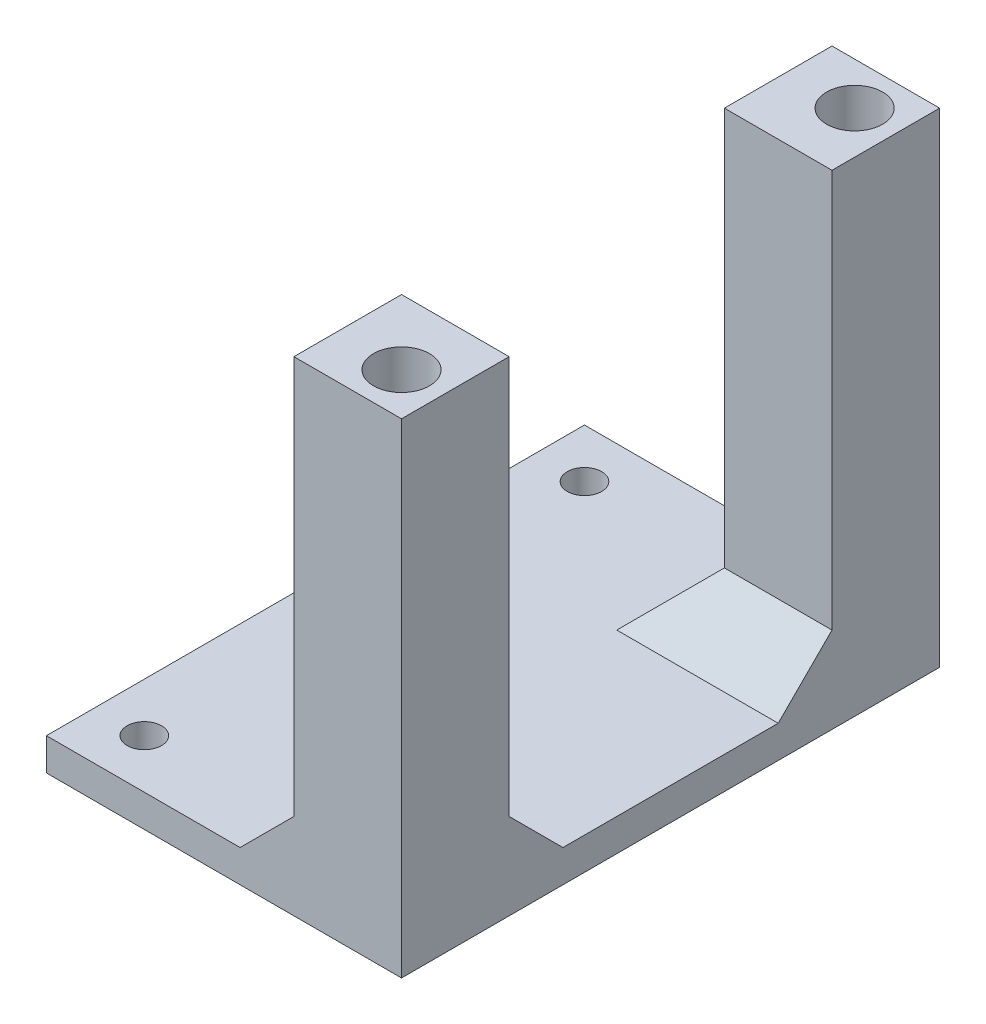
ISO-10303-21;
HEADER;
FILE_DESCRIPTION(('STEP AP214'),'2;1');
FILE_NAME('part.step','',(''),(''),'','','');
FILE_SCHEMA(('AUTOMOTIVE_DESIGN { 1 0 10303 214 1 1 1 1 }'));
ENDSEC;
DATA;
#1=APPLICATION_CONTEXT('core data for automotive mechanical design processes');
#2=APPLICATION_PROTOCOL_DEFINITION('international standard','automotive_design',2000,#1);
#3=PRODUCT_CONTEXT('',#1,'mechanical');
#4=PRODUCT('Part','Part','',(#3));
#5=PRODUCT_RELATED_PRODUCT_CATEGORY('part','',(#4));
#6=PRODUCT_DEFINITION_FORMATION('','',#4);
#7=PRODUCT_DEFINITION_CONTEXT('part definition',#1,'design');
#8=PRODUCT_DEFINITION('design','',#6,#7);
#9=PRODUCT_DEFINITION_SHAPE('','',#8);
#10=(LENGTH_UNIT() NAMED_UNIT(*) SI_UNIT(.MILLI.,.METRE.));
#11=(NAMED_UNIT(*) PLANE_ANGLE_UNIT() SI_UNIT($,.RADIAN.));
#12=(NAMED_UNIT(*) SI_UNIT($,.STERADIAN.) SOLID_ANGLE_UNIT());
#13=UNCERTAINTY_MEASURE_WITH_UNIT(LENGTH_MEASURE(1.E-05),#10,'distance_accuracy_value','');
#14=(GEOMETRIC_REPRESENTATION_CONTEXT(3) GLOBAL_UNCERTAINTY_ASSIGNED_CONTEXT((#13)) GLOBAL_UNIT_ASSIGNED_CONTEXT((#10,
#11,#12)) REPRESENTATION_CONTEXT('',''));
#15=CARTESIAN_POINT('',(0.,0.,0.));
#16=DIRECTION('',(0.,0.,1.));
#17=DIRECTION('',(1.,0.,0.));
#18=AXIS2_PLACEMENT_3D('',#15,#16,#17);
#19=CARTESIAN_POINT('',(0.,3.,0.));
#20=DIRECTION('',(0.,-1.,0.));
#21=DIRECTION('',(0.,0.,-1.));
#22=AXIS2_PLACEMENT_3D('',#19,#20,#21);
#23=PLANE('',#22);
#24=CARTESIAN_POINT('',(-1.96239669421488,3.,-5.13595041322314));
#25=DIRECTION('',(0.,1.,0.));
#26=DIRECTION('',(0.,0.,1.));
#27=AXIS2_PLACEMENT_3D('',#24,#25,#26);
#28=CIRCLE('',#27,1.6);
#29=CARTESIAN_POINT('',(-1.96239669421488,3.,-3.53595041322314));
#30=VERTEX_POINT('',#29);
#31=EDGE_CURVE('E277',#30,#30,#28,.T.);
#32=ORIENTED_EDGE('',*,*,#31,.F.);
#33=EDGE_LOOP('',(#32));
#34=FACE_BOUND('',#33,.T.);
#35=CARTESIAN_POINT('',(-1.96239669421487,3.,35.7640495867769));
#36=DIRECTION('',(0.,1.,0.));
#37=DIRECTION('',(0.,0.,1.));
#38=AXIS2_PLACEMENT_3D('',#35,#36,#37);
#39=CIRCLE('',#38,1.6);
#40=CARTESIAN_POINT('',(-1.96239669421487,3.,37.3640495867769));
#41=VERTEX_POINT('',#40);
#42=EDGE_CURVE('E269',#41,#41,#39,.T.);
#43=ORIENTED_EDGE('',*,*,#42,.F.);
#44=EDGE_LOOP('',(#43));
#45=FACE_BOUND('',#44,.T.);
#46=DIRECTION('',(-1.,0.,0.));
#47=VECTOR('',#46,1.);
#48=CARTESIAN_POINT('',(16.4876033057851,3.,5.31404958677684));
#49=LINE('',#48,#47);
#50=CARTESIAN_POINT('',(26.4876033057851,3.,5.31404958677684));
#51=VERTEX_POINT('',#50);
#52=CARTESIAN_POINT('',(11.4876033057851,3.,5.31404958677685));
#53=VERTEX_POINT('',#52);
#54=EDGE_CURVE('E329',#51,#53,#49,.T.);
#55=ORIENTED_EDGE('',*,*,#54,.T.);
#56=DIRECTION('',(0.,0.,-1.));
#57=VECTOR('',#56,1.);
#58=CARTESIAN_POINT('',(11.4876033057851,3.,-9.68595041322314));
#59=LINE('',#58,#57);
#60=CARTESIAN_POINT('',(11.4876033057851,3.,-9.68595041322314));
#61=VERTEX_POINT('',#60);
#62=EDGE_CURVE('E332',#53,#61,#59,.T.);
#63=ORIENTED_EDGE('',*,*,#62,.T.);
#64=DIRECTION('',(1.,0.,0.));
#65=VECTOR('',#64,1.);
#66=CARTESIAN_POINT('',(-6.51239669421488,3.,-9.68595041322314));
#67=LINE('',#66,#65);
#68=CARTESIAN_POINT('',(-6.51239669421488,3.,-9.68595041322314));
#69=VERTEX_POINT('',#68);
#70=EDGE_CURVE('E285',#69,#61,#67,.T.);
#71=ORIENTED_EDGE('',*,*,#70,.F.);
#72=DIRECTION('',(0.,0.,1.));
#73=VECTOR('',#72,1.);
#74=CARTESIAN_POINT('',(-6.51239669421488,3.,-9.68595041322314));
#75=LINE('',#74,#73);
#76=CARTESIAN_POINT('',(-6.51239669421487,3.,40.3140495867769));
#77=VERTEX_POINT('',#76);
#78=EDGE_CURVE('E207',#69,#77,#75,.T.);
#79=ORIENTED_EDGE('',*,*,#78,.T.);
#80=DIRECTION('',(1.,0.,0.));
#81=VECTOR('',#80,1.);
#82=CARTESIAN_POINT('',(1.48760330578513,3.,40.3140495867769));
#83=LINE('',#82,#81);
#84=CARTESIAN_POINT('',(11.4876033057852,3.,40.3140495867769));
#85=VERTEX_POINT('',#84);
#86=EDGE_CURVE('E293',#77,#85,#83,.T.);
#87=ORIENTED_EDGE('',*,*,#86,.T.);
#88=DIRECTION('',(0.,0.,-1.));
#89=VECTOR('',#88,1.);
#90=CARTESIAN_POINT('',(11.4876033057852,3.,30.3140495867769));
#91=LINE('',#90,#89);
#92=CARTESIAN_POINT('',(11.4876033057852,3.,25.3140495867769));
#93=VERTEX_POINT('',#92);
#94=EDGE_CURVE('E326',#85,#93,#91,.T.);
#95=ORIENTED_EDGE('',*,*,#94,.T.);
#96=DIRECTION('',(1.,0.,0.));
#97=VECTOR('',#96,1.);
#98=CARTESIAN_POINT('',(26.4876033057851,3.,25.3140495867769));
#99=LINE('',#98,#97);
#100=CARTESIAN_POINT('',(26.4876033057851,3.,25.3140495867769));
#101=VERTEX_POINT('',#100);
#102=EDGE_CURVE('E323',#93,#101,#99,.T.);
#103=ORIENTED_EDGE('',*,*,#102,.T.);
#104=DIRECTION('',(0.,0.,1.));
#105=VECTOR('',#104,1.);
#106=CARTESIAN_POINT('',(26.4876033057851,3.,-9.68595041322314));
#107=LINE('',#106,#105);
#108=EDGE_CURVE('E289',#51,#101,#107,.T.);
#109=ORIENTED_EDGE('',*,*,#108,.F.);
#110=EDGE_LOOP('',(#55,#63,#71,#79,#87,#95,#103,#109));
#111=FACE_BOUND('',#110,.T.);
#112=ADVANCED_FACE('F95',(#34,#45,#111),#23,.F.);
#113=CARTESIAN_POINT('',(0.,0.,0.));
#114=DIRECTION('',(0.,-1.,0.));
#115=DIRECTION('',(0.,0.,-1.));
#116=AXIS2_PLACEMENT_3D('',#113,#114,#115);
#117=PLANE('',#116);
#118=CARTESIAN_POINT('',(22.5376033057851,0.,36.3640495867769));
#119=DIRECTION('',(0.,-1.,0.));
#120=DIRECTION('',(0.,0.,-1.));
#121=AXIS2_PLACEMENT_3D('',#118,#119,#120);
#122=CIRCLE('',#121,2.6);
#123=CARTESIAN_POINT('',(22.5376033057851,0.,33.7640495867769));
#124=VERTEX_POINT('',#123);
#125=EDGE_CURVE('E228',#124,#124,#122,.T.);
#126=ORIENTED_EDGE('',*,*,#125,.F.);
#127=EDGE_LOOP('',(#126));
#128=FACE_BOUND('',#127,.T.);
#129=CARTESIAN_POINT('',(22.5376033057851,0.,-5.73595041322314));
#130=DIRECTION('',(0.,-1.,0.));
#131=DIRECTION('',(0.,0.,-1.));
#132=AXIS2_PLACEMENT_3D('',#129,#130,#131);
#133=CIRCLE('',#132,2.6);
#134=CARTESIAN_POINT('',(22.5376033057851,0.,-8.33595041322314));
#135=VERTEX_POINT('',#134);
#136=EDGE_CURVE('E370',#135,#135,#133,.T.);
#137=ORIENTED_EDGE('',*,*,#136,.F.);
#138=EDGE_LOOP('',(#137));
#139=FACE_BOUND('',#138,.T.);
#140=CARTESIAN_POINT('',(-1.96239669421488,0.,-5.13595041322314));
#141=DIRECTION('',(0.,1.,0.));
#142=DIRECTION('',(0.,0.,1.));
#143=AXIS2_PLACEMENT_3D('',#140,#141,#142);
#144=CIRCLE('',#143,1.6);
#145=CARTESIAN_POINT('',(-1.96239669421488,0.,-3.53595041322314));
#146=VERTEX_POINT('',#145);
#147=EDGE_CURVE('E273',#146,#146,#144,.T.);
#148=ORIENTED_EDGE('',*,*,#147,.T.);
#149=EDGE_LOOP('',(#148));
#150=FACE_BOUND('',#149,.T.);
#151=DIRECTION('',(0.,0.,1.));
#152=VECTOR('',#151,1.);
#153=CARTESIAN_POINT('',(-6.51239669421488,0.,-9.68595041322314));
#154=LINE('',#153,#152);
#155=CARTESIAN_POINT('',(-6.51239669421488,0.,-9.68595041322314));
#156=VERTEX_POINT('',#155);
#157=CARTESIAN_POINT('',(-6.51239669421487,0.,40.3140495867769));
#158=VERTEX_POINT('',#157);
#159=EDGE_CURVE('E290',#156,#158,#154,.T.);
#160=ORIENTED_EDGE('',*,*,#159,.F.);
#161=DIRECTION('',(1.,0.,0.));
#162=VECTOR('',#161,1.);
#163=CARTESIAN_POINT('',(1.48760330578512,0.,-9.68595041322314));
#164=LINE('',#163,#162);
#165=CARTESIAN_POINT('',(26.4876033057851,0.,-9.68595041322314));
#166=VERTEX_POINT('',#165);
#167=EDGE_CURVE('E281',#156,#166,#164,.T.);
#168=ORIENTED_EDGE('',*,*,#167,.T.);
#169=DIRECTION('',(0.,0.,1.));
#170=VECTOR('',#169,1.);
#171=CARTESIAN_POINT('',(26.4876033057851,0.,-9.68595041322314));
#172=LINE('',#171,#170);
#173=CARTESIAN_POINT('',(26.4876033057851,0.,40.3140495867769));
#174=VERTEX_POINT('',#173);
#175=EDGE_CURVE('E202',#166,#174,#172,.T.);
#176=ORIENTED_EDGE('',*,*,#175,.T.);
#177=DIRECTION('',(1.,0.,0.));
#178=VECTOR('',#177,1.);
#179=CARTESIAN_POINT('',(-6.51239669421487,0.,40.3140495867769));
#180=LINE('',#179,#178);
#181=EDGE_CURVE('E304',#158,#174,#180,.T.);
#182=ORIENTED_EDGE('',*,*,#181,.F.);
#183=EDGE_LOOP('',(#160,#168,#176,#182));
#184=FACE_BOUND('',#183,.T.);
#185=CARTESIAN_POINT('',(-1.96239669421487,0.,35.7640495867769));
#186=DIRECTION('',(0.,1.,0.));
#187=DIRECTION('',(0.,0.,1.));
#188=AXIS2_PLACEMENT_3D('',#185,#186,#187);
#189=CIRCLE('',#188,1.6);
#190=CARTESIAN_POINT('',(-1.96239669421487,0.,37.3640495867769));
#191=VERTEX_POINT('',#190);
#192=EDGE_CURVE('E268',#191,#191,#189,.T.);
#193=ORIENTED_EDGE('',*,*,#192,.T.);
#194=EDGE_LOOP('',(#193));
#195=FACE_BOUND('',#194,.T.);
#196=ADVANCED_FACE('F405',(#128,#139,#150,#184,#195),#117,.T.);
#197=CARTESIAN_POINT('',(-6.51239669421488,3.,-9.68595041322314));
#198=DIRECTION('',(1.,0.,0.));
#199=DIRECTION('',(0.,0.,-1.));
#200=AXIS2_PLACEMENT_3D('',#197,#198,#199);
#201=PLANE('',#200);
#202=ORIENTED_EDGE('',*,*,#159,.T.);
#203=DIRECTION('',(0.,-1.,0.));
#204=VECTOR('',#203,1.);
#205=CARTESIAN_POINT('',(-6.51239669421487,3.,40.3140495867769));
#206=LINE('',#205,#204);
#207=EDGE_CURVE('E314',#77,#158,#206,.T.);
#208=ORIENTED_EDGE('',*,*,#207,.F.);
#209=ORIENTED_EDGE('',*,*,#78,.F.);
#210=DIRECTION('',(0.,-1.,0.));
#211=VECTOR('',#210,1.);
#212=CARTESIAN_POINT('',(-6.51239669421488,3.,-9.68595041322314));
#213=LINE('',#212,#211);
#214=EDGE_CURVE('E309',#69,#156,#213,.T.);
#215=ORIENTED_EDGE('',*,*,#214,.T.);
#216=EDGE_LOOP('',(#202,#208,#209,#215));
#217=FACE_BOUND('',#216,.T.);
#218=ADVANCED_FACE('F411',(#217),#201,.F.);
#219=CARTESIAN_POINT('',(-6.51239669421487,3.,40.3140495867769));
#220=DIRECTION('',(0.,0.,-1.));
#221=DIRECTION('',(-1.,0.,0.));
#222=AXIS2_PLACEMENT_3D('',#219,#220,#221);
#223=PLANE('',#222);
#224=ORIENTED_EDGE('',*,*,#181,.T.);
#225=DIRECTION('',(0.,-1.,0.));
#226=VECTOR('',#225,1.);
#227=CARTESIAN_POINT('',(26.4876033057851,3.,40.3140495867769));
#228=LINE('',#227,#226);
#229=CARTESIAN_POINT('',(26.4876033057851,45.,40.3140495867769));
#230=VERTEX_POINT('',#229);
#231=EDGE_CURVE('E206',#230,#174,#228,.T.);
#232=ORIENTED_EDGE('',*,*,#231,.F.);
#233=DIRECTION('',(1.,0.,0.));
#234=VECTOR('',#233,1.);
#235=CARTESIAN_POINT('',(26.4876033057851,45.,40.3140495867769));
#236=LINE('',#235,#234);
#237=CARTESIAN_POINT('',(16.4876033057851,45.,40.3140495867769));
#238=VERTEX_POINT('',#237);
#239=EDGE_CURVE('E254',#238,#230,#236,.T.);
#240=ORIENTED_EDGE('',*,*,#239,.F.);
#241=DIRECTION('',(0.,-1.,0.));
#242=VECTOR('',#241,1.);
#243=CARTESIAN_POINT('',(16.4876033057851,45.,40.3140495867769));
#244=LINE('',#243,#242);
#245=CARTESIAN_POINT('',(16.4876033057851,8.00000000000004,40.3140495867769));
#246=VERTEX_POINT('',#245);
#247=EDGE_CURVE('E258',#238,#246,#244,.T.);
#248=ORIENTED_EDGE('',*,*,#247,.T.);
#249=DIRECTION('',(0.707106781186544,0.707106781186551,0.));
#250=VECTOR('',#249,1.);
#251=CARTESIAN_POINT('',(2.48760330578524,-6.00000000000001,40.3140495867769));
#252=LINE('',#251,#250);
#253=EDGE_CURVE('E106',#246,#85,#252,.F.);
#254=ORIENTED_EDGE('',*,*,#253,.T.);
#255=ORIENTED_EDGE('',*,*,#86,.F.);
#256=ORIENTED_EDGE('',*,*,#207,.T.);
#257=EDGE_LOOP('',(#224,#232,#240,#248,#254,#255,#256));
#258=FACE_BOUND('',#257,.T.);
#259=ADVANCED_FACE('F352',(#258),#223,.F.);
#260=CARTESIAN_POINT('',(26.4876033057851,3.,-9.68595041322314));
#261=DIRECTION('',(1.,0.,0.));
#262=DIRECTION('',(0.,0.,-1.));
#263=AXIS2_PLACEMENT_3D('',#260,#261,#262);
#264=PLANE('',#263);
#265=ORIENTED_EDGE('',*,*,#175,.F.);
#266=DIRECTION('',(0.,-1.,0.));
#267=VECTOR('',#266,1.);
#268=CARTESIAN_POINT('',(26.4876033057851,3.,-9.68595041322314));
#269=LINE('',#268,#267);
#270=CARTESIAN_POINT('',(26.4876033057851,45.,-9.68595041322314));
#271=VERTEX_POINT('',#270);
#272=EDGE_CURVE('E194',#271,#166,#269,.T.);
#273=ORIENTED_EDGE('',*,*,#272,.F.);
#274=DIRECTION('',(0.,0.,-1.));
#275=VECTOR('',#274,1.);
#276=CARTESIAN_POINT('',(26.4876033057851,45.,-9.68595041322314));
#277=LINE('',#276,#275);
#278=CARTESIAN_POINT('',(26.4876033057851,45.,0.314049586776862));
#279=VERTEX_POINT('',#278);
#280=EDGE_CURVE('E199',#279,#271,#277,.T.);
#281=ORIENTED_EDGE('',*,*,#280,.F.);
#282=DIRECTION('',(0.,-1.,0.));
#283=VECTOR('',#282,1.);
#284=CARTESIAN_POINT('',(26.4876033057851,45.,0.314049586776862));
#285=LINE('',#284,#283);
#286=CARTESIAN_POINT('',(26.4876033057851,8.00000000000006,0.314049586776862));
#287=VERTEX_POINT('',#286);
#288=EDGE_CURVE('E235',#279,#287,#285,.T.);
#289=ORIENTED_EDGE('',*,*,#288,.T.);
#290=DIRECTION('',(0.,0.707106781186552,-0.707106781186543));
#291=VECTOR('',#290,1.);
#292=CARTESIAN_POINT('',(26.4876033057851,8.00000000000004,0.314049586776862));
#293=LINE('',#292,#291);
#294=EDGE_CURVE('E347',#287,#51,#293,.F.);
#295=ORIENTED_EDGE('',*,*,#294,.T.);
#296=ORIENTED_EDGE('',*,*,#108,.T.);
#297=DIRECTION('',(0.,-0.707106781186551,-0.707106781186544));
#298=VECTOR('',#297,1.);
#299=CARTESIAN_POINT('',(26.4876033057851,8.00000000000003,30.3140495867769));
#300=LINE('',#299,#298);
#301=CARTESIAN_POINT('',(26.4876033057851,8.00000000000004,30.3140495867769));
#302=VERTEX_POINT('',#301);
#303=EDGE_CURVE('E14',#101,#302,#300,.F.);
#304=ORIENTED_EDGE('',*,*,#303,.T.);
#305=DIRECTION('',(0.,-1.,0.));
#306=VECTOR('',#305,1.);
#307=CARTESIAN_POINT('',(26.4876033057851,45.,30.3140495867769));
#308=LINE('',#307,#306);
#309=CARTESIAN_POINT('',(26.4876033057851,45.,30.3140495867769));
#310=VERTEX_POINT('',#309);
#311=EDGE_CURVE('E265',#310,#302,#308,.T.);
#312=ORIENTED_EDGE('',*,*,#311,.F.);
#313=DIRECTION('',(0.,0.,-1.));
#314=VECTOR('',#313,1.);
#315=CARTESIAN_POINT('',(26.4876033057851,45.,40.3140495867769));
#316=LINE('',#315,#314);
#317=EDGE_CURVE('E244',#230,#310,#316,.T.);
#318=ORIENTED_EDGE('',*,*,#317,.F.);
#319=ORIENTED_EDGE('',*,*,#231,.T.);
#320=EDGE_LOOP('',(#265,#273,#281,#289,#295,#296,#304,#312,#318,#319));
#321=FACE_BOUND('',#320,.T.);
#322=ADVANCED_FACE('F196',(#321),#264,.T.);
#323=CARTESIAN_POINT('',(1.48760330578512,3.,-9.68595041322314));
#324=DIRECTION('',(0.,0.,-1.));
#325=DIRECTION('',(-1.,0.,0.));
#326=AXIS2_PLACEMENT_3D('',#323,#324,#325);
#327=PLANE('',#326);
#328=ORIENTED_EDGE('',*,*,#167,.F.);
#329=ORIENTED_EDGE('',*,*,#214,.F.);
#330=ORIENTED_EDGE('',*,*,#70,.T.);
#331=DIRECTION('',(-0.707106781186543,-0.707106781186552,0.));
#332=VECTOR('',#331,1.);
#333=CARTESIAN_POINT('',(16.4876033057851,8.00000000000004,-9.68595041322314));
#334=LINE('',#333,#332);
#335=CARTESIAN_POINT('',(16.4876033057851,8.00000000000006,-9.68595041322314));
#336=VERTEX_POINT('',#335);
#337=EDGE_CURVE('E344',#61,#336,#334,.F.);
#338=ORIENTED_EDGE('',*,*,#337,.T.);
#339=DIRECTION('',(0.,-1.,0.));
#340=VECTOR('',#339,1.);
#341=CARTESIAN_POINT('',(16.4876033057851,45.,-9.68595041322314));
#342=LINE('',#341,#340);
#343=CARTESIAN_POINT('',(16.4876033057851,45.,-9.68595041322314));
#344=VERTEX_POINT('',#343);
#345=EDGE_CURVE('E213',#344,#336,#342,.T.);
#346=ORIENTED_EDGE('',*,*,#345,.F.);
#347=DIRECTION('',(-1.,0.,0.));
#348=VECTOR('',#347,1.);
#349=CARTESIAN_POINT('',(26.4876033057851,45.,-9.68595041322314));
#350=LINE('',#349,#348);
#351=EDGE_CURVE('E210',#271,#344,#350,.T.);
#352=ORIENTED_EDGE('',*,*,#351,.F.);
#353=ORIENTED_EDGE('',*,*,#272,.T.);
#354=EDGE_LOOP('',(#328,#329,#330,#338,#346,#352,#353));
#355=FACE_BOUND('',#354,.T.);
#356=ADVANCED_FACE('F211',(#355),#327,.T.);
#357=CARTESIAN_POINT('',(-1.96239669421488,3.,-5.13595041322314));
#358=DIRECTION('',(0.,-1.,0.));
#359=DIRECTION('',(0.,0.,-1.));
#360=AXIS2_PLACEMENT_3D('',#357,#358,#359);
#361=CYLINDRICAL_SURFACE('',#360,1.6);
#362=ORIENTED_EDGE('',*,*,#31,.T.);
#363=EDGE_LOOP('',(#362));
#364=FACE_BOUND('',#363,.T.);
#365=ORIENTED_EDGE('',*,*,#147,.F.);
#366=EDGE_LOOP('',(#365));
#367=FACE_BOUND('',#366,.T.);
#368=ADVANCED_FACE('F417',(#364,#367),#361,.F.);
#369=CARTESIAN_POINT('',(-1.96239669421487,3.,35.7640495867769));
#370=DIRECTION('',(0.,-1.,0.));
#371=DIRECTION('',(0.,0.,-1.));
#372=AXIS2_PLACEMENT_3D('',#369,#370,#371);
#373=CYLINDRICAL_SURFACE('',#372,1.6);
#374=ORIENTED_EDGE('',*,*,#42,.T.);
#375=EDGE_LOOP('',(#374));
#376=FACE_BOUND('',#375,.T.);
#377=ORIENTED_EDGE('',*,*,#192,.F.);
#378=EDGE_LOOP('',(#377));
#379=FACE_BOUND('',#378,.T.);
#380=ADVANCED_FACE('F473',(#376,#379),#373,.F.);
#381=CARTESIAN_POINT('',(26.4876033057851,45.,30.3140495867769));
#382=DIRECTION('',(0.,0.,1.));
#383=DIRECTION('',(1.,0.,0.));
#384=AXIS2_PLACEMENT_3D('',#381,#382,#383);
#385=PLANE('',#384);
#386=ORIENTED_EDGE('',*,*,#311,.T.);
#387=DIRECTION('',(-1.,0.,0.));
#388=VECTOR('',#387,1.);
#389=CARTESIAN_POINT('',(16.4876033057851,8.00000000000003,30.3140495867769));
#390=LINE('',#389,#388);
#391=CARTESIAN_POINT('',(16.4876033057851,8.00000000000004,30.3140495867769));
#392=VERTEX_POINT('',#391);
#393=EDGE_CURVE('E119',#302,#392,#390,.T.);
#394=ORIENTED_EDGE('',*,*,#393,.T.);
#395=DIRECTION('',(0.,-1.,0.));
#396=VECTOR('',#395,1.);
#397=CARTESIAN_POINT('',(16.4876033057851,45.,30.3140495867769));
#398=LINE('',#397,#396);
#399=CARTESIAN_POINT('',(16.4876033057851,45.,30.3140495867769));
#400=VERTEX_POINT('',#399);
#401=EDGE_CURVE('E262',#400,#392,#398,.T.);
#402=ORIENTED_EDGE('',*,*,#401,.F.);
#403=DIRECTION('',(-1.,0.,0.));
#404=VECTOR('',#403,1.);
#405=CARTESIAN_POINT('',(26.4876033057851,45.,30.3140495867769));
#406=LINE('',#405,#404);
#407=EDGE_CURVE('E248',#310,#400,#406,.T.);
#408=ORIENTED_EDGE('',*,*,#407,.F.);
#409=EDGE_LOOP('',(#386,#394,#402,#408));
#410=FACE_BOUND('',#409,.T.);
#411=ADVANCED_FACE('F470',(#410),#385,.F.);
#412=CARTESIAN_POINT('',(16.4876033057851,45.,40.3140495867769));
#413=DIRECTION('',(1.,0.,0.));
#414=DIRECTION('',(0.,0.,-1.));
#415=AXIS2_PLACEMENT_3D('',#412,#413,#414);
#416=PLANE('',#415);
#417=ORIENTED_EDGE('',*,*,#401,.T.);
#418=DIRECTION('',(0.,0.,1.));
#419=VECTOR('',#418,1.);
#420=CARTESIAN_POINT('',(16.4876033057851,8.00000000000003,40.3140495867769));
#421=LINE('',#420,#419);
#422=EDGE_CURVE('E338',#392,#246,#421,.T.);
#423=ORIENTED_EDGE('',*,*,#422,.T.);
#424=ORIENTED_EDGE('',*,*,#247,.F.);
#425=DIRECTION('',(0.,0.,1.));
#426=VECTOR('',#425,1.);
#427=CARTESIAN_POINT('',(16.4876033057851,45.,40.3140495867769));
#428=LINE('',#427,#426);
#429=EDGE_CURVE('E251',#400,#238,#428,.T.);
#430=ORIENTED_EDGE('',*,*,#429,.F.);
#431=EDGE_LOOP('',(#417,#423,#424,#430));
#432=FACE_BOUND('',#431,.T.);
#433=ADVANCED_FACE('F464',(#432),#416,.F.);
#434=CARTESIAN_POINT('',(0.,45.,0.));
#435=DIRECTION('',(0.,1.,0.));
#436=DIRECTION('',(0.,0.,1.));
#437=AXIS2_PLACEMENT_3D('',#434,#435,#436);
#438=PLANE('',#437);
#439=CARTESIAN_POINT('',(22.5376033057851,45.,36.3640495867769));
#440=DIRECTION('',(0.,1.,0.));
#441=DIRECTION('',(0.,0.,1.));
#442=AXIS2_PLACEMENT_3D('',#439,#440,#441);
#443=CIRCLE('',#442,2.6);
#444=CARTESIAN_POINT('',(22.5376033057851,45.,38.9640495867769));
#445=VERTEX_POINT('',#444);
#446=EDGE_CURVE('E375',#445,#445,#443,.T.);
#447=ORIENTED_EDGE('',*,*,#446,.F.);
#448=EDGE_LOOP('',(#447));
#449=FACE_BOUND('',#448,.T.);
#450=ORIENTED_EDGE('',*,*,#317,.T.);
#451=ORIENTED_EDGE('',*,*,#407,.T.);
#452=ORIENTED_EDGE('',*,*,#429,.T.);
#453=ORIENTED_EDGE('',*,*,#239,.T.);
#454=EDGE_LOOP('',(#450,#451,#452,#453));
#455=FACE_BOUND('',#454,.T.);
#456=ADVANCED_FACE('F459',(#449,#455),#438,.T.);
#457=CARTESIAN_POINT('',(16.4876033057851,45.,-9.68595041322314));
#458=DIRECTION('',(1.,0.,0.));
#459=DIRECTION('',(0.,0.,-1.));
#460=AXIS2_PLACEMENT_3D('',#457,#458,#459);
#461=PLANE('',#460);
#462=ORIENTED_EDGE('',*,*,#345,.T.);
#463=DIRECTION('',(0.,0.,1.));
#464=VECTOR('',#463,1.);
#465=CARTESIAN_POINT('',(16.4876033057851,8.00000000000004,0.314049586776863));
#466=LINE('',#465,#464);
#467=CARTESIAN_POINT('',(16.4876033057851,8.00000000000006,0.314049586776863));
#468=VERTEX_POINT('',#467);
#469=EDGE_CURVE('E313',#336,#468,#466,.T.);
#470=ORIENTED_EDGE('',*,*,#469,.T.);
#471=DIRECTION('',(0.,-1.,0.));
#472=VECTOR('',#471,1.);
#473=CARTESIAN_POINT('',(16.4876033057851,45.,0.314049586776863));
#474=LINE('',#473,#472);
#475=CARTESIAN_POINT('',(16.4876033057851,45.,0.314049586776863));
#476=VERTEX_POINT('',#475);
#477=EDGE_CURVE('E238',#476,#468,#474,.T.);
#478=ORIENTED_EDGE('',*,*,#477,.F.);
#479=DIRECTION('',(0.,0.,1.));
#480=VECTOR('',#479,1.);
#481=CARTESIAN_POINT('',(16.4876033057851,45.,-9.68595041322314));
#482=LINE('',#481,#480);
#483=EDGE_CURVE('E217',#344,#476,#482,.T.);
#484=ORIENTED_EDGE('',*,*,#483,.F.);
#485=EDGE_LOOP('',(#462,#470,#478,#484));
#486=FACE_BOUND('',#485,.T.);
#487=ADVANCED_FACE('F400',(#486),#461,.F.);
#488=CARTESIAN_POINT('',(26.4876033057851,45.,0.314049586776862));
#489=DIRECTION('',(0.,0.,-1.));
#490=DIRECTION('',(-1.,0.,0.));
#491=AXIS2_PLACEMENT_3D('',#488,#489,#490);
#492=PLANE('',#491);
#493=ORIENTED_EDGE('',*,*,#477,.T.);
#494=DIRECTION('',(1.,0.,0.));
#495=VECTOR('',#494,1.);
#496=CARTESIAN_POINT('',(26.4876033057851,8.00000000000004,0.314049586776862));
#497=LINE('',#496,#495);
#498=EDGE_CURVE('E335',#468,#287,#497,.T.);
#499=ORIENTED_EDGE('',*,*,#498,.T.);
#500=ORIENTED_EDGE('',*,*,#288,.F.);
#501=DIRECTION('',(1.,0.,0.));
#502=VECTOR('',#501,1.);
#503=CARTESIAN_POINT('',(26.4876033057851,45.,0.314049586776862));
#504=LINE('',#503,#502);
#505=EDGE_CURVE('E221',#476,#279,#504,.T.);
#506=ORIENTED_EDGE('',*,*,#505,.F.);
#507=EDGE_LOOP('',(#493,#499,#500,#506));
#508=FACE_BOUND('',#507,.T.);
#509=ADVANCED_FACE('F391',(#508),#492,.F.);
#510=CARTESIAN_POINT('',(0.,45.,0.));
#511=DIRECTION('',(0.,-1.,0.));
#512=DIRECTION('',(0.,0.,-1.));
#513=AXIS2_PLACEMENT_3D('',#510,#511,#512);
#514=PLANE('',#513);
#515=CARTESIAN_POINT('',(22.5376033057851,45.,-5.73595041322314));
#516=DIRECTION('',(0.,1.,0.));
#517=DIRECTION('',(0.,0.,1.));
#518=AXIS2_PLACEMENT_3D('',#515,#516,#517);
#519=CIRCLE('',#518,2.6);
#520=CARTESIAN_POINT('',(22.5376033057851,45.,-3.13595041322314));
#521=VERTEX_POINT('',#520);
#522=EDGE_CURVE('E380',#521,#521,#519,.T.);
#523=ORIENTED_EDGE('',*,*,#522,.F.);
#524=EDGE_LOOP('',(#523));
#525=FACE_BOUND('',#524,.T.);
#526=ORIENTED_EDGE('',*,*,#280,.T.);
#527=ORIENTED_EDGE('',*,*,#351,.T.);
#528=ORIENTED_EDGE('',*,*,#483,.T.);
#529=ORIENTED_EDGE('',*,*,#505,.T.);
#530=EDGE_LOOP('',(#526,#527,#528,#529));
#531=FACE_BOUND('',#530,.T.);
#532=ADVANCED_FACE('F219',(#525,#531),#514,.F.);
#533=CARTESIAN_POINT('',(26.4876033057851,8.00000000000004,0.314049586776862));
#534=DIRECTION('',(0.,0.707106781186543,0.707106781186552));
#535=DIRECTION('',(-1.,0.,0.));
#536=AXIS2_PLACEMENT_3D('',#533,#534,#535);
#537=PLANE('',#536);
#538=ORIENTED_EDGE('',*,*,#294,.F.);
#539=ORIENTED_EDGE('',*,*,#498,.F.);
#540=DIRECTION('',(-0.577350269189624,-0.57735026918963,0.577350269189623));
#541=VECTOR('',#540,1.);
#542=CARTESIAN_POINT('',(19.8209366391184,11.3333333333334,-3.01928374655645));
#543=LINE('',#542,#541);
#544=EDGE_CURVE('E224',#53,#468,#543,.F.);
#545=ORIENTED_EDGE('',*,*,#544,.F.);
#546=ORIENTED_EDGE('',*,*,#54,.F.);
#547=EDGE_LOOP('',(#538,#539,#545,#546));
#548=FACE_BOUND('',#547,.T.);
#549=ADVANCED_FACE('F390',(#548),#537,.T.);
#550=CARTESIAN_POINT('',(16.4876033057851,8.00000000000004,-9.68595041322314));
#551=DIRECTION('',(-0.707106781186552,0.707106781186543,0.));
#552=DIRECTION('',(0.,0.,-1.));
#553=AXIS2_PLACEMENT_3D('',#550,#551,#552);
#554=PLANE('',#553);
#555=ORIENTED_EDGE('',*,*,#337,.F.);
#556=ORIENTED_EDGE('',*,*,#62,.F.);
#557=ORIENTED_EDGE('',*,*,#544,.T.);
#558=ORIENTED_EDGE('',*,*,#469,.F.);
#559=EDGE_LOOP('',(#555,#556,#557,#558));
#560=FACE_BOUND('',#559,.T.);
#561=ADVANCED_FACE('F397',(#560),#554,.T.);
#562=CARTESIAN_POINT('',(26.4876033057851,8.00000000000003,30.3140495867769));
#563=DIRECTION('',(0.,0.707106781186544,-0.707106781186551));
#564=DIRECTION('',(1.,0.,0.));
#565=AXIS2_PLACEMENT_3D('',#562,#563,#564);
#566=PLANE('',#565);
#567=ORIENTED_EDGE('',*,*,#303,.F.);
#568=ORIENTED_EDGE('',*,*,#102,.F.);
#569=DIRECTION('',(0.577350269189624,0.57735026918963,0.577350269189624));
#570=VECTOR('',#569,1.);
#571=CARTESIAN_POINT('',(19.8209366391184,11.3333333333334,33.6473829201102));
#572=LINE('',#571,#570);
#573=EDGE_CURVE('E100',#392,#93,#572,.F.);
#574=ORIENTED_EDGE('',*,*,#573,.F.);
#575=ORIENTED_EDGE('',*,*,#393,.F.);
#576=EDGE_LOOP('',(#567,#568,#574,#575));
#577=FACE_BOUND('',#576,.T.);
#578=ADVANCED_FACE('F98',(#577),#566,.T.);
#579=CARTESIAN_POINT('',(16.4876033057851,8.00000000000003,40.3140495867769));
#580=DIRECTION('',(-0.707106781186551,0.707106781186544,0.));
#581=DIRECTION('',(0.,0.,-1.));
#582=AXIS2_PLACEMENT_3D('',#579,#580,#581);
#583=PLANE('',#582);
#584=ORIENTED_EDGE('',*,*,#573,.T.);
#585=ORIENTED_EDGE('',*,*,#94,.F.);
#586=ORIENTED_EDGE('',*,*,#253,.F.);
#587=ORIENTED_EDGE('',*,*,#422,.F.);
#588=EDGE_LOOP('',(#584,#585,#586,#587));
#589=FACE_BOUND('',#588,.T.);
#590=ADVANCED_FACE('F364',(#589),#583,.T.);
#591=CARTESIAN_POINT('',(22.5376033057851,-7.,-5.73595041322314));
#592=DIRECTION('',(0.,1.,0.));
#593=DIRECTION('',(0.,0.,1.));
#594=AXIS2_PLACEMENT_3D('',#591,#592,#593);
#595=CYLINDRICAL_SURFACE('',#594,2.6);
#596=ORIENTED_EDGE('',*,*,#136,.T.);
#597=EDGE_LOOP('',(#596));
#598=FACE_BOUND('',#597,.T.);
#599=ORIENTED_EDGE('',*,*,#522,.T.);
#600=EDGE_LOOP('',(#599));
#601=FACE_BOUND('',#600,.T.);
#602=ADVANCED_FACE('F387',(#598,#601),#595,.F.);
#603=CARTESIAN_POINT('',(22.5376033057851,-7.,36.3640495867769));
#604=DIRECTION('',(0.,1.,0.));
#605=DIRECTION('',(0.,0.,1.));
#606=AXIS2_PLACEMENT_3D('',#603,#604,#605);
#607=CYLINDRICAL_SURFACE('',#606,2.6);
#608=ORIENTED_EDGE('',*,*,#125,.T.);
#609=EDGE_LOOP('',(#608));
#610=FACE_BOUND('',#609,.T.);
#611=ORIENTED_EDGE('',*,*,#446,.T.);
#612=EDGE_LOOP('',(#611));
#613=FACE_BOUND('',#612,.T.);
#614=ADVANCED_FACE('F445',(#610,#613),#607,.F.);
#615=CLOSED_SHELL('',(#112,#196,#218,#259,#322,#356,#368,#380,#411,#433,#456,#487,#509,#532,
#549,#561,#578,#590,#602,#614));
#616=MANIFOLD_SOLID_BREP('B2',#615);
#617=ADVANCED_BREP_SHAPE_REPRESENTATION('',(#18,#616),#14);
#618=SHAPE_DEFINITION_REPRESENTATION(#9,#617);
ENDSEC;
END-ISO-10303-21;
